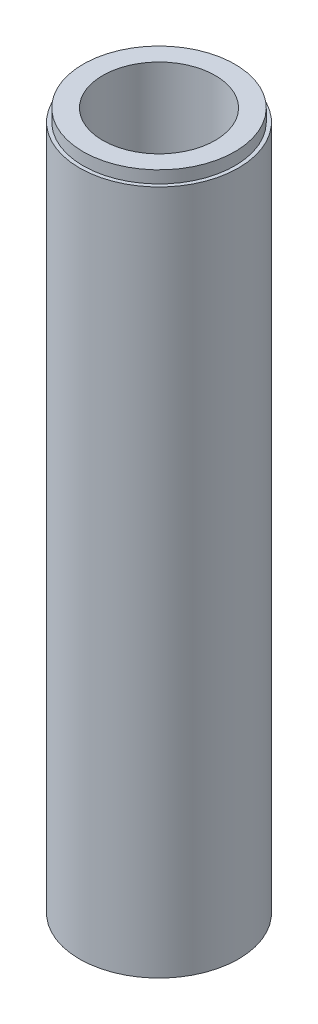
ISO-10303-21;
HEADER;
FILE_DESCRIPTION(('STEP AP214'),'2;1');
FILE_NAME('part.step','',(''),(''),'','','');
FILE_SCHEMA(('AUTOMOTIVE_DESIGN { 1 0 10303 214 1 1 1 1 }'));
ENDSEC;
DATA;
#1=APPLICATION_CONTEXT('core data for automotive mechanical design processes');
#2=APPLICATION_PROTOCOL_DEFINITION('international standard','automotive_design',2000,#1);
#3=PRODUCT_CONTEXT('',#1,'mechanical');
#4=PRODUCT('Part','Part','',(#3));
#5=PRODUCT_RELATED_PRODUCT_CATEGORY('part','',(#4));
#6=PRODUCT_DEFINITION_FORMATION('','',#4);
#7=PRODUCT_DEFINITION_CONTEXT('part definition',#1,'design');
#8=PRODUCT_DEFINITION('design','',#6,#7);
#9=PRODUCT_DEFINITION_SHAPE('','',#8);
#10=(LENGTH_UNIT() NAMED_UNIT(*) SI_UNIT(.MILLI.,.METRE.));
#11=(NAMED_UNIT(*) PLANE_ANGLE_UNIT() SI_UNIT($,.RADIAN.));
#12=(NAMED_UNIT(*) SI_UNIT($,.STERADIAN.) SOLID_ANGLE_UNIT());
#13=UNCERTAINTY_MEASURE_WITH_UNIT(LENGTH_MEASURE(1.E-05),#10,'distance_accuracy_value','');
#14=(GEOMETRIC_REPRESENTATION_CONTEXT(3) GLOBAL_UNCERTAINTY_ASSIGNED_CONTEXT((#13)) GLOBAL_UNIT_ASSIGNED_CONTEXT((#10,
#11,#12)) REPRESENTATION_CONTEXT('',''));
#15=CARTESIAN_POINT('',(0.,0.,0.));
#16=DIRECTION('',(0.,0.,1.));
#17=DIRECTION('',(1.,0.,0.));
#18=AXIS2_PLACEMENT_3D('',#15,#16,#17);
#19=CARTESIAN_POINT('',(0.,28.,0.));
#20=DIRECTION('',(0.,1.,0.));
#21=DIRECTION('',(0.,0.,1.));
#22=AXIS2_PLACEMENT_3D('',#19,#20,#21);
#23=PLANE('',#22);
#24=CARTESIAN_POINT('',(0.,28.,0.));
#25=DIRECTION('',(0.,1.,0.));
#26=DIRECTION('',(0.,0.,1.));
#27=AXIS2_PLACEMENT_3D('',#24,#25,#26);
#28=CIRCLE('',#27,3.1);
#29=CARTESIAN_POINT('',(0.,28.,3.1));
#30=VERTEX_POINT('',#29);
#31=EDGE_CURVE('E10',#30,#30,#28,.T.);
#32=ORIENTED_EDGE('',*,*,#31,.F.);
#33=EDGE_LOOP('',(#32));
#34=FACE_BOUND('',#33,.T.);
#35=CARTESIAN_POINT('',(0.,28.,0.));
#36=DIRECTION('',(0.,1.,0.));
#37=DIRECTION('',(0.,0.,1.));
#38=AXIS2_PLACEMENT_3D('',#35,#36,#37);
#39=CIRCLE('',#38,3.25);
#40=CARTESIAN_POINT('',(0.,28.,3.25));
#41=VERTEX_POINT('',#40);
#42=EDGE_CURVE('E39',#41,#41,#39,.T.);
#43=ORIENTED_EDGE('',*,*,#42,.T.);
#44=EDGE_LOOP('',(#43));
#45=FACE_BOUND('',#44,.T.);
#46=ADVANCED_FACE('F31',(#34,#45),#23,.T.);
#47=CARTESIAN_POINT('',(0.,0.,0.));
#48=DIRECTION('',(0.,1.,0.));
#49=DIRECTION('',(0.,0.,1.));
#50=AXIS2_PLACEMENT_3D('',#47,#48,#49);
#51=PLANE('',#50);
#52=CARTESIAN_POINT('',(0.,0.,0.));
#53=DIRECTION('',(0.,1.,0.));
#54=DIRECTION('',(0.,0.,1.));
#55=AXIS2_PLACEMENT_3D('',#52,#53,#54);
#56=CIRCLE('',#55,3.25);
#57=CARTESIAN_POINT('',(0.,0.,3.25));
#58=VERTEX_POINT('',#57);
#59=EDGE_CURVE('E35',#58,#58,#56,.T.);
#60=ORIENTED_EDGE('',*,*,#59,.F.);
#61=EDGE_LOOP('',(#60));
#62=FACE_BOUND('',#61,.T.);
#63=CARTESIAN_POINT('',(0.,0.,0.));
#64=DIRECTION('',(0.,1.,0.));
#65=DIRECTION('',(0.,0.,1.));
#66=AXIS2_PLACEMENT_3D('',#63,#64,#65);
#67=CIRCLE('',#66,2.3);
#68=CARTESIAN_POINT('',(0.,0.,2.3));
#69=VERTEX_POINT('',#68);
#70=EDGE_CURVE('E48',#69,#69,#67,.T.);
#71=ORIENTED_EDGE('',*,*,#70,.T.);
#72=EDGE_LOOP('',(#71));
#73=FACE_BOUND('',#72,.T.);
#74=ADVANCED_FACE('F75',(#62,#73),#51,.F.);
#75=CARTESIAN_POINT('',(0.,28.,0.));
#76=DIRECTION('',(0.,-1.,0.));
#77=DIRECTION('',(0.,0.,-1.));
#78=AXIS2_PLACEMENT_3D('',#75,#76,#77);
#79=CYLINDRICAL_SURFACE('',#78,3.25);
#80=ORIENTED_EDGE('',*,*,#42,.F.);
#81=EDGE_LOOP('',(#80));
#82=FACE_BOUND('',#81,.T.);
#83=ORIENTED_EDGE('',*,*,#59,.T.);
#84=EDGE_LOOP('',(#83));
#85=FACE_BOUND('',#84,.T.);
#86=ADVANCED_FACE('F33',(#82,#85),#79,.T.);
#87=CARTESIAN_POINT('',(0.,28.,0.));
#88=DIRECTION('',(0.,-1.,0.));
#89=DIRECTION('',(0.,0.,-1.));
#90=AXIS2_PLACEMENT_3D('',#87,#88,#89);
#91=CYLINDRICAL_SURFACE('',#90,2.3);
#92=ORIENTED_EDGE('',*,*,#70,.F.);
#93=EDGE_LOOP('',(#92));
#94=FACE_BOUND('',#93,.T.);
#95=CARTESIAN_POINT('',(0.,28.5,0.));
#96=DIRECTION('',(0.,1.,0.));
#97=DIRECTION('',(0.,0.,1.));
#98=AXIS2_PLACEMENT_3D('',#95,#96,#97);
#99=CIRCLE('',#98,2.3);
#100=CARTESIAN_POINT('',(0.,28.5,2.3));
#101=VERTEX_POINT('',#100);
#102=EDGE_CURVE('E54',#101,#101,#99,.T.);
#103=ORIENTED_EDGE('',*,*,#102,.T.);
#104=EDGE_LOOP('',(#103));
#105=FACE_BOUND('',#104,.T.);
#106=ADVANCED_FACE('F60',(#94,#105),#91,.F.);
#107=CARTESIAN_POINT('',(0.,28.5,0.));
#108=DIRECTION('',(0.,1.,0.));
#109=DIRECTION('',(0.,0.,1.));
#110=AXIS2_PLACEMENT_3D('',#107,#108,#109);
#111=PLANE('',#110);
#112=CARTESIAN_POINT('',(0.,28.5,0.));
#113=DIRECTION('',(0.,1.,0.));
#114=DIRECTION('',(0.,0.,1.));
#115=AXIS2_PLACEMENT_3D('',#112,#113,#114);
#116=CIRCLE('',#115,3.1);
#117=CARTESIAN_POINT('',(0.,28.5,3.1));
#118=VERTEX_POINT('',#117);
#119=EDGE_CURVE('E46',#118,#118,#116,.T.);
#120=ORIENTED_EDGE('',*,*,#119,.T.);
#121=EDGE_LOOP('',(#120));
#122=FACE_BOUND('',#121,.T.);
#123=ORIENTED_EDGE('',*,*,#102,.F.);
#124=EDGE_LOOP('',(#123));
#125=FACE_BOUND('',#124,.T.);
#126=ADVANCED_FACE('F62',(#122,#125),#111,.T.);
#127=CARTESIAN_POINT('',(0.,28.5,0.));
#128=DIRECTION('',(0.,-1.,0.));
#129=DIRECTION('',(0.,0.,-1.));
#130=AXIS2_PLACEMENT_3D('',#127,#128,#129);
#131=CYLINDRICAL_SURFACE('',#130,3.1);
#132=ORIENTED_EDGE('',*,*,#119,.F.);
#133=EDGE_LOOP('',(#132));
#134=FACE_BOUND('',#133,.T.);
#135=ORIENTED_EDGE('',*,*,#31,.T.);
#136=EDGE_LOOP('',(#135));
#137=FACE_BOUND('',#136,.T.);
#138=ADVANCED_FACE('F64',(#134,#137),#131,.T.);
#139=CLOSED_SHELL('',(#46,#74,#86,#106,#126,#138));
#140=MANIFOLD_SOLID_BREP('B2',#139);
#141=ADVANCED_BREP_SHAPE_REPRESENTATION('',(#18,#140),#14);
#142=SHAPE_DEFINITION_REPRESENTATION(#9,#141);
ENDSEC;
END-ISO-10303-21;
